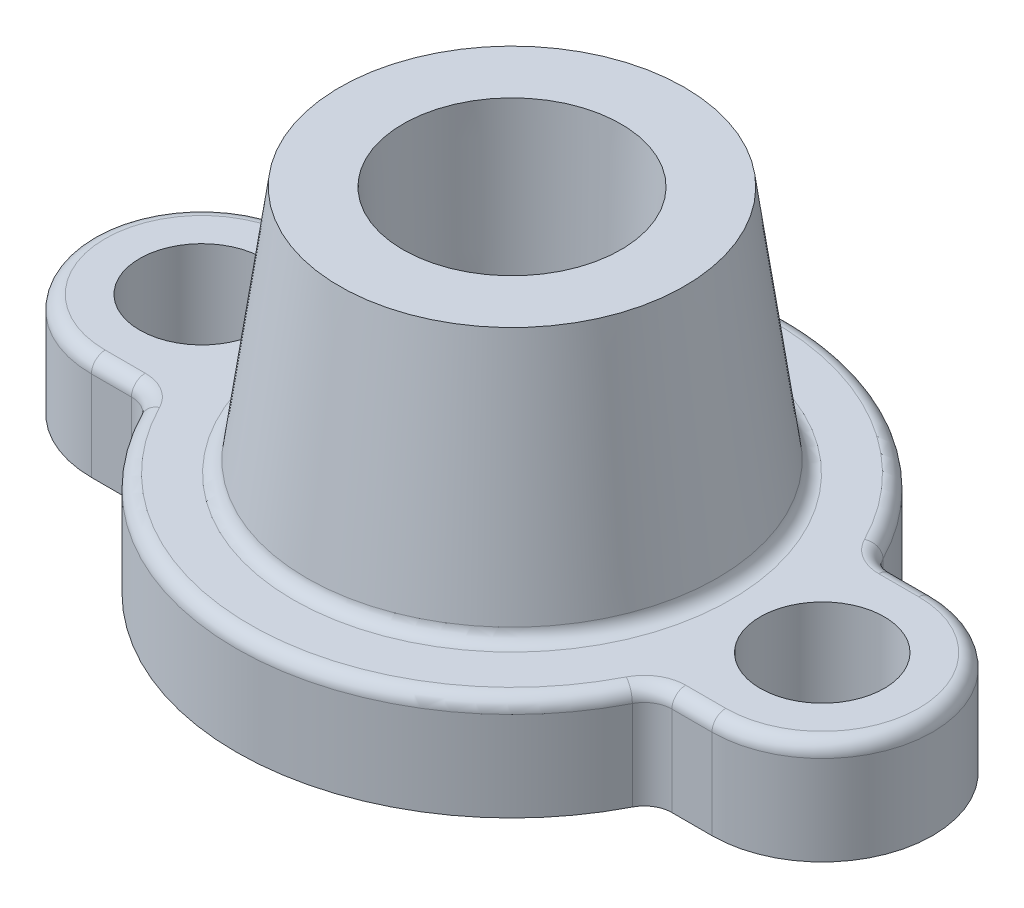
ISO-10303-21;
HEADER;
FILE_DESCRIPTION(('STEP AP214'),'2;1');
FILE_NAME('part.step','',(''),(''),'','','');
FILE_SCHEMA(('AUTOMOTIVE_DESIGN { 1 0 10303 214 1 1 1 1 }'));
ENDSEC;
DATA;
#1=APPLICATION_CONTEXT('core data for automotive mechanical design processes');
#2=APPLICATION_PROTOCOL_DEFINITION('international standard','automotive_design',2000,#1);
#3=PRODUCT_CONTEXT('',#1,'mechanical');
#4=PRODUCT('Part','Part','',(#3));
#5=PRODUCT_RELATED_PRODUCT_CATEGORY('part','',(#4));
#6=PRODUCT_DEFINITION_FORMATION('','',#4);
#7=PRODUCT_DEFINITION_CONTEXT('part definition',#1,'design');
#8=PRODUCT_DEFINITION('design','',#6,#7);
#9=PRODUCT_DEFINITION_SHAPE('','',#8);
#10=(LENGTH_UNIT() NAMED_UNIT(*) SI_UNIT(.MILLI.,.METRE.));
#11=(NAMED_UNIT(*) PLANE_ANGLE_UNIT() SI_UNIT($,.RADIAN.));
#12=(NAMED_UNIT(*) SI_UNIT($,.STERADIAN.) SOLID_ANGLE_UNIT());
#13=UNCERTAINTY_MEASURE_WITH_UNIT(LENGTH_MEASURE(1.E-05),#10,'distance_accuracy_value','');
#14=(GEOMETRIC_REPRESENTATION_CONTEXT(3) GLOBAL_UNCERTAINTY_ASSIGNED_CONTEXT((#13)) GLOBAL_UNIT_ASSIGNED_CONTEXT((#10,
#11,#12)) REPRESENTATION_CONTEXT('',''));
#15=CARTESIAN_POINT('',(0.,0.,0.));
#16=DIRECTION('',(0.,0.,1.));
#17=DIRECTION('',(1.,0.,0.));
#18=AXIS2_PLACEMENT_3D('',#15,#16,#17);
#19=CARTESIAN_POINT('',(0.,7.50000000000001,0.));
#20=DIRECTION('',(0.,1.,0.));
#21=DIRECTION('',(0.,0.,1.));
#22=AXIS2_PLACEMENT_3D('',#19,#20,#21);
#23=PLANE('',#22);
#24=CARTESIAN_POINT('',(0.,7.50000000000001,0.));
#25=DIRECTION('',(0.,1.,0.));
#26=DIRECTION('',(0.,0.,1.));
#27=AXIS2_PLACEMENT_3D('',#24,#25,#26);
#28=CIRCLE('',#27,15.8707101025215);
#29=CARTESIAN_POINT('',(0.,7.50000000000001,15.8707101025215));
#30=VERTEX_POINT('',#29);
#31=EDGE_CURVE('E260',#30,#30,#28,.F.);
#32=ORIENTED_EDGE('',*,*,#31,.T.);
#33=EDGE_LOOP('',(#32));
#34=FACE_BOUND('',#33,.T.);
#35=CARTESIAN_POINT('',(19.5959179422654,7.50000000000001,-10.));
#36=DIRECTION('',(0.,1.,0.));
#37=DIRECTION('',(0.,0.,1.));
#38=AXIS2_PLACEMENT_3D('',#35,#36,#37);
#39=CIRCLE('',#38,3.);
#40=CARTESIAN_POINT('',(19.5959179422654,7.50000000000001,-7.));
#41=VERTEX_POINT('',#40);
#42=CARTESIAN_POINT('',(16.9237473137747,7.50000000000001,-8.63636363636364));
#43=VERTEX_POINT('',#42);
#44=EDGE_CURVE('E256',#41,#43,#39,.F.);
#45=ORIENTED_EDGE('',*,*,#44,.T.);
#46=CARTESIAN_POINT('',(0.,7.50000000000001,0.));
#47=DIRECTION('',(0.,1.,0.));
#48=DIRECTION('',(0.,0.,1.));
#49=AXIS2_PLACEMENT_3D('',#46,#47,#48);
#50=CIRCLE('',#49,19.);
#51=CARTESIAN_POINT('',(-16.9237473137747,7.50000000000001,-8.63636363636364));
#52=VERTEX_POINT('',#51);
#53=EDGE_CURVE('E258',#43,#52,#50,.T.);
#54=ORIENTED_EDGE('',*,*,#53,.T.);
#55=CARTESIAN_POINT('',(-19.5959179422654,7.50000000000001,-10.));
#56=DIRECTION('',(0.,1.,0.));
#57=DIRECTION('',(0.,0.,1.));
#58=AXIS2_PLACEMENT_3D('',#55,#56,#57);
#59=CIRCLE('',#58,3.);
#60=CARTESIAN_POINT('',(-19.5959179422654,7.50000000000001,-7.));
#61=VERTEX_POINT('',#60);
#62=EDGE_CURVE('E250',#52,#61,#59,.F.);
#63=ORIENTED_EDGE('',*,*,#62,.T.);
#64=DIRECTION('',(-1.,0.,0.));
#65=VECTOR('',#64,1.);
#66=CARTESIAN_POINT('',(-22.5,7.50000000000001,-7.00000000000001));
#67=LINE('',#66,#65);
#68=CARTESIAN_POINT('',(-22.5,7.50000000000001,-7.));
#69=VERTEX_POINT('',#68);
#70=EDGE_CURVE('E245',#61,#69,#67,.T.);
#71=ORIENTED_EDGE('',*,*,#70,.T.);
#72=CARTESIAN_POINT('',(-22.5,7.50000000000001,0.));
#73=DIRECTION('',(0.,1.,0.));
#74=DIRECTION('',(0.,0.,1.));
#75=AXIS2_PLACEMENT_3D('',#72,#73,#74);
#76=CIRCLE('',#75,7.);
#77=CARTESIAN_POINT('',(-22.5,7.50000000000001,7.));
#78=VERTEX_POINT('',#77);
#79=EDGE_CURVE('E235',#69,#78,#76,.T.);
#80=ORIENTED_EDGE('',*,*,#79,.T.);
#81=DIRECTION('',(1.,0.,0.));
#82=VECTOR('',#81,1.);
#83=CARTESIAN_POINT('',(-19.5959179422654,7.50000000000001,7.));
#84=LINE('',#83,#82);
#85=CARTESIAN_POINT('',(-19.5959179422654,7.50000000000001,7.));
#86=VERTEX_POINT('',#85);
#87=EDGE_CURVE('E237',#78,#86,#84,.T.);
#88=ORIENTED_EDGE('',*,*,#87,.T.);
#89=CARTESIAN_POINT('',(-19.5959179422654,7.50000000000001,10.));
#90=DIRECTION('',(0.,1.,0.));
#91=DIRECTION('',(0.,0.,1.));
#92=AXIS2_PLACEMENT_3D('',#89,#90,#91);
#93=CIRCLE('',#92,3.);
#94=CARTESIAN_POINT('',(-16.9237473137747,7.50000000000001,8.63636363636364));
#95=VERTEX_POINT('',#94);
#96=EDGE_CURVE('E239',#86,#95,#93,.F.);
#97=ORIENTED_EDGE('',*,*,#96,.T.);
#98=CARTESIAN_POINT('',(0.,7.50000000000001,0.));
#99=DIRECTION('',(0.,1.,0.));
#100=DIRECTION('',(0.,0.,1.));
#101=AXIS2_PLACEMENT_3D('',#98,#99,#100);
#102=CIRCLE('',#101,19.);
#103=CARTESIAN_POINT('',(16.9237473137747,7.50000000000001,8.63636363636364));
#104=VERTEX_POINT('',#103);
#105=EDGE_CURVE('E241',#95,#104,#102,.T.);
#106=ORIENTED_EDGE('',*,*,#105,.T.);
#107=CARTESIAN_POINT('',(19.5959179422654,7.50000000000001,10.));
#108=DIRECTION('',(0.,1.,0.));
#109=DIRECTION('',(0.,0.,1.));
#110=AXIS2_PLACEMENT_3D('',#107,#108,#109);
#111=CIRCLE('',#110,3.);
#112=CARTESIAN_POINT('',(19.5959179422654,7.50000000000001,7.));
#113=VERTEX_POINT('',#112);
#114=EDGE_CURVE('E243',#104,#113,#111,.F.);
#115=ORIENTED_EDGE('',*,*,#114,.T.);
#116=DIRECTION('',(1.,0.,0.));
#117=VECTOR('',#116,1.);
#118=CARTESIAN_POINT('',(22.5,7.50000000000001,7.));
#119=LINE('',#118,#117);
#120=CARTESIAN_POINT('',(22.5,7.50000000000001,7.));
#121=VERTEX_POINT('',#120);
#122=EDGE_CURVE('E248',#113,#121,#119,.T.);
#123=ORIENTED_EDGE('',*,*,#122,.T.);
#124=CARTESIAN_POINT('',(22.5,7.50000000000001,0.));
#125=DIRECTION('',(0.,1.,0.));
#126=DIRECTION('',(0.,0.,1.));
#127=AXIS2_PLACEMENT_3D('',#124,#125,#126);
#128=CIRCLE('',#127,7.);
#129=CARTESIAN_POINT('',(22.5,7.50000000000001,-7.));
#130=VERTEX_POINT('',#129);
#131=EDGE_CURVE('E252',#121,#130,#128,.T.);
#132=ORIENTED_EDGE('',*,*,#131,.T.);
#133=DIRECTION('',(-1.,0.,0.));
#134=VECTOR('',#133,1.);
#135=CARTESIAN_POINT('',(19.5959179422654,7.50000000000001,-7.));
#136=LINE('',#135,#134);
#137=EDGE_CURVE('E254',#130,#41,#136,.T.);
#138=ORIENTED_EDGE('',*,*,#137,.T.);
#139=EDGE_LOOP('',(#45,#54,#63,#71,#80,#88,#97,#106,#115,#123,#132,#138));
#140=FACE_BOUND('',#139,.T.);
#141=CARTESIAN_POINT('',(-22.5,7.50000000000001,0.));
#142=DIRECTION('',(0.,1.,0.));
#143=DIRECTION('',(0.,0.,1.));
#144=AXIS2_PLACEMENT_3D('',#141,#142,#143);
#145=CIRCLE('',#144,4.5);
#146=CARTESIAN_POINT('',(-22.5,7.50000000000001,4.5));
#147=VERTEX_POINT('',#146);
#148=EDGE_CURVE('E356',#147,#147,#145,.T.);
#149=ORIENTED_EDGE('',*,*,#148,.F.);
#150=EDGE_LOOP('',(#149));
#151=FACE_BOUND('',#150,.T.);
#152=CARTESIAN_POINT('',(22.5,7.50000000000001,0.));
#153=DIRECTION('',(0.,1.,0.));
#154=DIRECTION('',(0.,0.,1.));
#155=AXIS2_PLACEMENT_3D('',#152,#153,#154);
#156=CIRCLE('',#155,4.5);
#157=CARTESIAN_POINT('',(22.5,7.50000000000001,4.5));
#158=VERTEX_POINT('',#157);
#159=EDGE_CURVE('E350',#158,#158,#156,.T.);
#160=ORIENTED_EDGE('',*,*,#159,.F.);
#161=EDGE_LOOP('',(#160));
#162=FACE_BOUND('',#161,.T.);
#163=ADVANCED_FACE('F32',(#34,#140,#151,#162),#23,.T.);
#164=CARTESIAN_POINT('',(0.,0.,0.));
#165=DIRECTION('',(0.,1.,0.));
#166=DIRECTION('',(0.,0.,1.));
#167=AXIS2_PLACEMENT_3D('',#164,#165,#166);
#168=PLANE('',#167);
#169=CARTESIAN_POINT('',(0.,0.,0.));
#170=DIRECTION('',(0.,1.,0.));
#171=DIRECTION('',(0.,0.,1.));
#172=AXIS2_PLACEMENT_3D('',#169,#170,#171);
#173=CIRCLE('',#172,7.50000000000001);
#174=CARTESIAN_POINT('',(0.,0.,7.50000000000001));
#175=VERTEX_POINT('',#174);
#176=EDGE_CURVE('E11',#175,#175,#173,.T.);
#177=ORIENTED_EDGE('',*,*,#176,.T.);
#178=EDGE_LOOP('',(#177));
#179=FACE_BOUND('',#178,.T.);
#180=CARTESIAN_POINT('',(-22.5,0.,0.));
#181=DIRECTION('',(0.,1.,0.));
#182=DIRECTION('',(0.,0.,1.));
#183=AXIS2_PLACEMENT_3D('',#180,#181,#182);
#184=CIRCLE('',#183,4.5);
#185=CARTESIAN_POINT('',(-22.5,0.,4.5));
#186=VERTEX_POINT('',#185);
#187=EDGE_CURVE('E353',#186,#186,#184,.T.);
#188=ORIENTED_EDGE('',*,*,#187,.T.);
#189=EDGE_LOOP('',(#188));
#190=FACE_BOUND('',#189,.T.);
#191=CARTESIAN_POINT('',(0.,0.,0.));
#192=DIRECTION('',(0.,1.,0.));
#193=DIRECTION('',(0.,0.,1.));
#194=AXIS2_PLACEMENT_3D('',#191,#192,#193);
#195=CIRCLE('',#194,20.);
#196=CARTESIAN_POINT('',(17.8144708566049,0.,-9.09090909090909));
#197=VERTEX_POINT('',#196);
#198=CARTESIAN_POINT('',(-17.8144708566049,0.,-9.0909090909091));
#199=VERTEX_POINT('',#198);
#200=EDGE_CURVE('E182',#197,#199,#195,.T.);
#201=ORIENTED_EDGE('',*,*,#200,.F.);
#202=CARTESIAN_POINT('',(19.5959179422654,0.,-10.));
#203=DIRECTION('',(0.,1.,0.));
#204=DIRECTION('',(0.,0.,1.));
#205=AXIS2_PLACEMENT_3D('',#202,#203,#204);
#206=CIRCLE('',#205,2.);
#207=CARTESIAN_POINT('',(19.5959179422654,0.,-8.));
#208=VERTEX_POINT('',#207);
#209=EDGE_CURVE('E229',#197,#208,#206,.T.);
#210=ORIENTED_EDGE('',*,*,#209,.T.);
#211=DIRECTION('',(-1.,0.,0.));
#212=VECTOR('',#211,1.);
#213=CARTESIAN_POINT('',(22.5,0.,-8.00000000000001));
#214=LINE('',#213,#212);
#215=CARTESIAN_POINT('',(22.5,0.,-8.00000000000001));
#216=VERTEX_POINT('',#215);
#217=EDGE_CURVE('E202',#216,#208,#214,.T.);
#218=ORIENTED_EDGE('',*,*,#217,.F.);
#219=CARTESIAN_POINT('',(22.5,0.,0.));
#220=DIRECTION('',(0.,1.,0.));
#221=DIRECTION('',(0.,0.,1.));
#222=AXIS2_PLACEMENT_3D('',#219,#220,#221);
#223=CIRCLE('',#222,8.);
#224=CARTESIAN_POINT('',(22.5,0.,8.));
#225=VERTEX_POINT('',#224);
#226=EDGE_CURVE('E199',#225,#216,#223,.T.);
#227=ORIENTED_EDGE('',*,*,#226,.F.);
#228=DIRECTION('',(1.,0.,0.));
#229=VECTOR('',#228,1.);
#230=CARTESIAN_POINT('',(18.3303027798234,0.,8.));
#231=LINE('',#230,#229);
#232=CARTESIAN_POINT('',(19.5959179422654,0.,8.));
#233=VERTEX_POINT('',#232);
#234=EDGE_CURVE('E196',#233,#225,#231,.T.);
#235=ORIENTED_EDGE('',*,*,#234,.F.);
#236=CARTESIAN_POINT('',(19.5959179422654,0.,10.));
#237=DIRECTION('',(0.,1.,0.));
#238=DIRECTION('',(0.,0.,1.));
#239=AXIS2_PLACEMENT_3D('',#236,#237,#238);
#240=CIRCLE('',#239,2.);
#241=CARTESIAN_POINT('',(17.8144708566049,0.,9.09090909090909));
#242=VERTEX_POINT('',#241);
#243=EDGE_CURVE('E227',#233,#242,#240,.T.);
#244=ORIENTED_EDGE('',*,*,#243,.T.);
#245=CARTESIAN_POINT('',(0.,0.,0.));
#246=DIRECTION('',(0.,1.,0.));
#247=DIRECTION('',(0.,0.,1.));
#248=AXIS2_PLACEMENT_3D('',#245,#246,#247);
#249=CIRCLE('',#248,20.);
#250=CARTESIAN_POINT('',(-17.8144708566049,0.,9.09090909090909));
#251=VERTEX_POINT('',#250);
#252=EDGE_CURVE('E190',#251,#242,#249,.T.);
#253=ORIENTED_EDGE('',*,*,#252,.F.);
#254=CARTESIAN_POINT('',(-19.5959179422654,0.,10.));
#255=DIRECTION('',(0.,1.,0.));
#256=DIRECTION('',(0.,0.,1.));
#257=AXIS2_PLACEMENT_3D('',#254,#255,#256);
#258=CIRCLE('',#257,2.);
#259=CARTESIAN_POINT('',(-19.5959179422654,0.,8.));
#260=VERTEX_POINT('',#259);
#261=EDGE_CURVE('E233',#251,#260,#258,.T.);
#262=ORIENTED_EDGE('',*,*,#261,.T.);
#263=DIRECTION('',(1.,0.,0.));
#264=VECTOR('',#263,1.);
#265=CARTESIAN_POINT('',(-22.5,0.,8.));
#266=LINE('',#265,#264);
#267=CARTESIAN_POINT('',(-22.5,0.,8.));
#268=VERTEX_POINT('',#267);
#269=EDGE_CURVE('E188',#268,#260,#266,.T.);
#270=ORIENTED_EDGE('',*,*,#269,.F.);
#271=CARTESIAN_POINT('',(-22.5,0.,0.));
#272=DIRECTION('',(0.,1.,0.));
#273=DIRECTION('',(0.,0.,1.));
#274=AXIS2_PLACEMENT_3D('',#271,#272,#273);
#275=CIRCLE('',#274,8.);
#276=CARTESIAN_POINT('',(-22.5,0.,-8.));
#277=VERTEX_POINT('',#276);
#278=EDGE_CURVE('E165',#277,#268,#275,.T.);
#279=ORIENTED_EDGE('',*,*,#278,.F.);
#280=DIRECTION('',(-1.,0.,0.));
#281=VECTOR('',#280,1.);
#282=CARTESIAN_POINT('',(-18.3303027798234,0.,-8.));
#283=LINE('',#282,#281);
#284=CARTESIAN_POINT('',(-19.5959179422654,0.,-8.00000000000001));
#285=VERTEX_POINT('',#284);
#286=EDGE_CURVE('E176',#285,#277,#283,.T.);
#287=ORIENTED_EDGE('',*,*,#286,.F.);
#288=CARTESIAN_POINT('',(-19.5959179422654,0.,-10.));
#289=DIRECTION('',(0.,1.,0.));
#290=DIRECTION('',(0.,0.,1.));
#291=AXIS2_PLACEMENT_3D('',#288,#289,#290);
#292=CIRCLE('',#291,2.);
#293=EDGE_CURVE('E231',#285,#199,#292,.T.);
#294=ORIENTED_EDGE('',*,*,#293,.T.);
#295=EDGE_LOOP('',(#201,#210,#218,#227,#235,#244,#253,#262,#270,#279,#287,#294));
#296=FACE_BOUND('',#295,.T.);
#297=CARTESIAN_POINT('',(22.5,0.,0.));
#298=DIRECTION('',(0.,1.,0.));
#299=DIRECTION('',(0.,0.,1.));
#300=AXIS2_PLACEMENT_3D('',#297,#298,#299);
#301=CIRCLE('',#300,4.5);
#302=CARTESIAN_POINT('',(22.5,0.,4.5));
#303=VERTEX_POINT('',#302);
#304=EDGE_CURVE('E349',#303,#303,#301,.T.);
#305=ORIENTED_EDGE('',*,*,#304,.T.);
#306=EDGE_LOOP('',(#305));
#307=FACE_BOUND('',#306,.T.);
#308=ADVANCED_FACE('F185',(#179,#190,#296,#307),#168,.F.);
#309=CARTESIAN_POINT('',(0.,7.50000000000001,0.));
#310=DIRECTION('',(0.,-1.,0.));
#311=DIRECTION('',(0.,0.,-1.));
#312=AXIS2_PLACEMENT_3D('',#309,#310,#311);
#313=CYLINDRICAL_SURFACE('',#312,20.);
#314=DIRECTION('',(0.,-1.,0.));
#315=VECTOR('',#314,1.);
#316=CARTESIAN_POINT('',(-17.8144708566049,7.50000000000001,-9.0909090909091));
#317=LINE('',#316,#315);
#318=CARTESIAN_POINT('',(-17.8144708566049,6.50000000000001,-9.0909090909091));
#319=VERTEX_POINT('',#318);
#320=EDGE_CURVE('E216',#199,#319,#317,.F.);
#321=ORIENTED_EDGE('',*,*,#320,.T.);
#322=CARTESIAN_POINT('',(0.,6.50000000000001,0.));
#323=DIRECTION('',(0.,1.,0.));
#324=DIRECTION('',(0.,0.,1.));
#325=AXIS2_PLACEMENT_3D('',#322,#323,#324);
#326=CIRCLE('',#325,20.);
#327=CARTESIAN_POINT('',(17.8144708566049,6.50000000000001,-9.09090909090909));
#328=VERTEX_POINT('',#327);
#329=EDGE_CURVE('E267',#319,#328,#326,.F.);
#330=ORIENTED_EDGE('',*,*,#329,.T.);
#331=DIRECTION('',(0.,-1.,0.));
#332=VECTOR('',#331,1.);
#333=CARTESIAN_POINT('',(17.8144708566049,7.50000000000001,-9.09090909090909));
#334=LINE('',#333,#332);
#335=EDGE_CURVE('E219',#328,#197,#334,.T.);
#336=ORIENTED_EDGE('',*,*,#335,.T.);
#337=ORIENTED_EDGE('',*,*,#200,.T.);
#338=EDGE_LOOP('',(#321,#330,#336,#337));
#339=FACE_BOUND('',#338,.T.);
#340=ADVANCED_FACE('F363',(#339),#313,.T.);
#341=CARTESIAN_POINT('',(-18.3303027798234,7.50000000000001,-8.));
#342=DIRECTION('',(0.,0.,1.));
#343=DIRECTION('',(1.,0.,0.));
#344=AXIS2_PLACEMENT_3D('',#341,#342,#343);
#345=PLANE('',#344);
#346=DIRECTION('',(0.,-1.,0.));
#347=VECTOR('',#346,1.);
#348=CARTESIAN_POINT('',(-22.5,7.50000000000001,-8.));
#349=LINE('',#348,#347);
#350=CARTESIAN_POINT('',(-22.5,6.50000000000001,-8.));
#351=VERTEX_POINT('',#350);
#352=EDGE_CURVE('E160',#351,#277,#349,.T.);
#353=ORIENTED_EDGE('',*,*,#352,.F.);
#354=DIRECTION('',(-1.,0.,0.));
#355=VECTOR('',#354,1.);
#356=CARTESIAN_POINT('',(-19.5959179422654,6.50000000000001,-8.00000000000001));
#357=LINE('',#356,#355);
#358=CARTESIAN_POINT('',(-19.5959179422654,6.50000000000001,-8.00000000000001));
#359=VERTEX_POINT('',#358);
#360=EDGE_CURVE('E263',#351,#359,#357,.F.);
#361=ORIENTED_EDGE('',*,*,#360,.T.);
#362=DIRECTION('',(0.,1.,0.));
#363=VECTOR('',#362,1.);
#364=CARTESIAN_POINT('',(-19.5959179422654,0.,-8.00000000000001));
#365=LINE('',#364,#363);
#366=EDGE_CURVE('E179',#359,#285,#365,.F.);
#367=ORIENTED_EDGE('',*,*,#366,.T.);
#368=ORIENTED_EDGE('',*,*,#286,.T.);
#369=EDGE_LOOP('',(#353,#361,#367,#368));
#370=FACE_BOUND('',#369,.T.);
#371=ADVANCED_FACE('F177',(#370),#345,.F.);
#372=CARTESIAN_POINT('',(-22.5,7.50000000000001,0.));
#373=DIRECTION('',(0.,-1.,0.));
#374=DIRECTION('',(0.,0.,-1.));
#375=AXIS2_PLACEMENT_3D('',#372,#373,#374);
#376=CYLINDRICAL_SURFACE('',#375,8.);
#377=DIRECTION('',(0.,-1.,0.));
#378=VECTOR('',#377,1.);
#379=CARTESIAN_POINT('',(-22.5,7.50000000000001,8.));
#380=LINE('',#379,#378);
#381=CARTESIAN_POINT('',(-22.5,6.50000000000001,8.));
#382=VERTEX_POINT('',#381);
#383=EDGE_CURVE('E173',#382,#268,#380,.T.);
#384=ORIENTED_EDGE('',*,*,#383,.F.);
#385=CARTESIAN_POINT('',(-22.5,6.50000000000001,0.));
#386=DIRECTION('',(0.,1.,0.));
#387=DIRECTION('',(0.,0.,1.));
#388=AXIS2_PLACEMENT_3D('',#385,#386,#387);
#389=CIRCLE('',#388,8.);
#390=EDGE_CURVE('E168',#382,#351,#389,.F.);
#391=ORIENTED_EDGE('',*,*,#390,.T.);
#392=ORIENTED_EDGE('',*,*,#352,.T.);
#393=ORIENTED_EDGE('',*,*,#278,.T.);
#394=EDGE_LOOP('',(#384,#391,#392,#393));
#395=FACE_BOUND('',#394,.T.);
#396=ADVANCED_FACE('F163',(#395),#376,.T.);
#397=CARTESIAN_POINT('',(-22.5,7.50000000000001,8.));
#398=DIRECTION('',(0.,0.,-1.));
#399=DIRECTION('',(-1.,0.,0.));
#400=AXIS2_PLACEMENT_3D('',#397,#398,#399);
#401=PLANE('',#400);
#402=DIRECTION('',(0.,1.,0.));
#403=VECTOR('',#402,1.);
#404=CARTESIAN_POINT('',(-19.5959179422654,7.50000000000001,8.));
#405=LINE('',#404,#403);
#406=CARTESIAN_POINT('',(-19.5959179422654,6.50000000000001,8.));
#407=VERTEX_POINT('',#406);
#408=EDGE_CURVE('E224',#260,#407,#405,.T.);
#409=ORIENTED_EDGE('',*,*,#408,.T.);
#410=DIRECTION('',(1.,0.,0.));
#411=VECTOR('',#410,1.);
#412=CARTESIAN_POINT('',(-22.5,6.50000000000001,8.));
#413=LINE('',#412,#411);
#414=EDGE_CURVE('E277',#407,#382,#413,.F.);
#415=ORIENTED_EDGE('',*,*,#414,.T.);
#416=ORIENTED_EDGE('',*,*,#383,.T.);
#417=ORIENTED_EDGE('',*,*,#269,.T.);
#418=EDGE_LOOP('',(#409,#415,#416,#417));
#419=FACE_BOUND('',#418,.T.);
#420=ADVANCED_FACE('F671',(#419),#401,.F.);
#421=CARTESIAN_POINT('',(0.,7.50000000000001,0.));
#422=DIRECTION('',(0.,-1.,0.));
#423=DIRECTION('',(0.,0.,-1.));
#424=AXIS2_PLACEMENT_3D('',#421,#422,#423);
#425=CYLINDRICAL_SURFACE('',#424,20.);
#426=DIRECTION('',(0.,-1.,0.));
#427=VECTOR('',#426,1.);
#428=CARTESIAN_POINT('',(17.8144708566049,7.50000000000001,9.09090909090909));
#429=LINE('',#428,#427);
#430=CARTESIAN_POINT('',(17.8144708566049,6.50000000000001,9.09090909090909));
#431=VERTEX_POINT('',#430);
#432=EDGE_CURVE('E213',#242,#431,#429,.F.);
#433=ORIENTED_EDGE('',*,*,#432,.T.);
#434=CARTESIAN_POINT('',(0.,6.50000000000001,0.));
#435=DIRECTION('',(0.,1.,0.));
#436=DIRECTION('',(0.,0.,1.));
#437=AXIS2_PLACEMENT_3D('',#434,#435,#436);
#438=CIRCLE('',#437,20.);
#439=CARTESIAN_POINT('',(-17.8144708566049,6.50000000000001,9.09090909090909));
#440=VERTEX_POINT('',#439);
#441=EDGE_CURVE('E273',#431,#440,#438,.F.);
#442=ORIENTED_EDGE('',*,*,#441,.T.);
#443=DIRECTION('',(0.,-1.,0.));
#444=VECTOR('',#443,1.);
#445=CARTESIAN_POINT('',(-17.8144708566049,7.50000000000001,9.09090909090909));
#446=LINE('',#445,#444);
#447=EDGE_CURVE('E211',#440,#251,#446,.T.);
#448=ORIENTED_EDGE('',*,*,#447,.T.);
#449=ORIENTED_EDGE('',*,*,#252,.T.);
#450=EDGE_LOOP('',(#433,#442,#448,#449));
#451=FACE_BOUND('',#450,.T.);
#452=ADVANCED_FACE('F662',(#451),#425,.T.);
#453=CARTESIAN_POINT('',(18.3303027798234,7.50000000000001,8.));
#454=DIRECTION('',(0.,0.,-1.));
#455=DIRECTION('',(-1.,0.,0.));
#456=AXIS2_PLACEMENT_3D('',#453,#454,#455);
#457=PLANE('',#456);
#458=DIRECTION('',(0.,-1.,0.));
#459=VECTOR('',#458,1.);
#460=CARTESIAN_POINT('',(22.5,7.50000000000001,8.));
#461=LINE('',#460,#459);
#462=CARTESIAN_POINT('',(22.5,6.50000000000001,8.));
#463=VERTEX_POINT('',#462);
#464=EDGE_CURVE('E207',#463,#225,#461,.T.);
#465=ORIENTED_EDGE('',*,*,#464,.F.);
#466=DIRECTION('',(1.,0.,0.));
#467=VECTOR('',#466,1.);
#468=CARTESIAN_POINT('',(19.5959179422654,6.50000000000001,8.));
#469=LINE('',#468,#467);
#470=CARTESIAN_POINT('',(19.5959179422654,6.50000000000001,8.));
#471=VERTEX_POINT('',#470);
#472=EDGE_CURVE('E280',#463,#471,#469,.F.);
#473=ORIENTED_EDGE('',*,*,#472,.T.);
#474=DIRECTION('',(0.,1.,0.));
#475=VECTOR('',#474,1.);
#476=CARTESIAN_POINT('',(19.5959179422654,0.,8.));
#477=LINE('',#476,#475);
#478=EDGE_CURVE('E172',#471,#233,#477,.F.);
#479=ORIENTED_EDGE('',*,*,#478,.T.);
#480=ORIENTED_EDGE('',*,*,#234,.T.);
#481=EDGE_LOOP('',(#465,#473,#479,#480));
#482=FACE_BOUND('',#481,.T.);
#483=ADVANCED_FACE('F414',(#482),#457,.F.);
#484=CARTESIAN_POINT('',(22.5,7.50000000000001,0.));
#485=DIRECTION('',(0.,-1.,0.));
#486=DIRECTION('',(0.,0.,-1.));
#487=AXIS2_PLACEMENT_3D('',#484,#485,#486);
#488=CYLINDRICAL_SURFACE('',#487,8.);
#489=DIRECTION('',(0.,-1.,0.));
#490=VECTOR('',#489,1.);
#491=CARTESIAN_POINT('',(22.5,7.50000000000001,-8.00000000000001));
#492=LINE('',#491,#490);
#493=CARTESIAN_POINT('',(22.5,6.50000000000001,-8.00000000000001));
#494=VERTEX_POINT('',#493);
#495=EDGE_CURVE('E205',#494,#216,#492,.T.);
#496=ORIENTED_EDGE('',*,*,#495,.F.);
#497=CARTESIAN_POINT('',(22.5,6.50000000000001,0.));
#498=DIRECTION('',(0.,1.,0.));
#499=DIRECTION('',(0.,0.,1.));
#500=AXIS2_PLACEMENT_3D('',#497,#498,#499);
#501=CIRCLE('',#500,8.);
#502=EDGE_CURVE('E49',#494,#463,#501,.F.);
#503=ORIENTED_EDGE('',*,*,#502,.T.);
#504=ORIENTED_EDGE('',*,*,#464,.T.);
#505=ORIENTED_EDGE('',*,*,#226,.T.);
#506=EDGE_LOOP('',(#496,#503,#504,#505));
#507=FACE_BOUND('',#506,.T.);
#508=ADVANCED_FACE('F423',(#507),#488,.T.);
#509=CARTESIAN_POINT('',(22.5,7.50000000000001,-8.00000000000001));
#510=DIRECTION('',(0.,0.,1.));
#511=DIRECTION('',(1.,0.,0.));
#512=AXIS2_PLACEMENT_3D('',#509,#510,#511);
#513=PLANE('',#512);
#514=DIRECTION('',(0.,1.,0.));
#515=VECTOR('',#514,1.);
#516=CARTESIAN_POINT('',(19.5959179422654,7.50000000000001,-8.));
#517=LINE('',#516,#515);
#518=CARTESIAN_POINT('',(19.5959179422654,6.50000000000001,-8.));
#519=VERTEX_POINT('',#518);
#520=EDGE_CURVE('E221',#208,#519,#517,.T.);
#521=ORIENTED_EDGE('',*,*,#520,.T.);
#522=DIRECTION('',(-1.,0.,0.));
#523=VECTOR('',#522,1.);
#524=CARTESIAN_POINT('',(22.5,6.50000000000001,-8.00000000000001));
#525=LINE('',#524,#523);
#526=EDGE_CURVE('E57',#519,#494,#525,.F.);
#527=ORIENTED_EDGE('',*,*,#526,.T.);
#528=ORIENTED_EDGE('',*,*,#495,.T.);
#529=ORIENTED_EDGE('',*,*,#217,.T.);
#530=EDGE_LOOP('',(#521,#527,#528,#529));
#531=FACE_BOUND('',#530,.T.);
#532=ADVANCED_FACE('F424',(#531),#513,.F.);
#533=CARTESIAN_POINT('',(-22.5,7.50000000000001,0.));
#534=DIRECTION('',(0.,-1.,0.));
#535=DIRECTION('',(0.,0.,-1.));
#536=AXIS2_PLACEMENT_3D('',#533,#534,#535);
#537=CYLINDRICAL_SURFACE('',#536,4.5);
#538=ORIENTED_EDGE('',*,*,#148,.T.);
#539=EDGE_LOOP('',(#538));
#540=FACE_BOUND('',#539,.T.);
#541=ORIENTED_EDGE('',*,*,#187,.F.);
#542=EDGE_LOOP('',(#541));
#543=FACE_BOUND('',#542,.T.);
#544=ADVANCED_FACE('F426',(#540,#543),#537,.F.);
#545=CARTESIAN_POINT('',(22.5,7.50000000000001,0.));
#546=DIRECTION('',(0.,-1.,0.));
#547=DIRECTION('',(0.,0.,-1.));
#548=AXIS2_PLACEMENT_3D('',#545,#546,#547);
#549=CYLINDRICAL_SURFACE('',#548,4.5);
#550=ORIENTED_EDGE('',*,*,#159,.T.);
#551=EDGE_LOOP('',(#550));
#552=FACE_BOUND('',#551,.T.);
#553=ORIENTED_EDGE('',*,*,#304,.F.);
#554=EDGE_LOOP('',(#553));
#555=FACE_BOUND('',#554,.T.);
#556=ADVANCED_FACE('F432',(#552,#555),#549,.F.);
#557=CARTESIAN_POINT('',(19.5959179422654,7.50000000000001,10.));
#558=DIRECTION('',(0.,-1.,0.));
#559=DIRECTION('',(0.,0.,-1.));
#560=AXIS2_PLACEMENT_3D('',#557,#558,#559);
#561=CYLINDRICAL_SURFACE('',#560,2.);
#562=ORIENTED_EDGE('',*,*,#478,.F.);
#563=CARTESIAN_POINT('',(19.5959179422654,6.50000000000001,10.));
#564=DIRECTION('',(0.,1.,0.));
#565=DIRECTION('',(0.,0.,1.));
#566=AXIS2_PLACEMENT_3D('',#563,#564,#565);
#567=CIRCLE('',#566,2.);
#568=EDGE_CURVE('E271',#471,#431,#567,.T.);
#569=ORIENTED_EDGE('',*,*,#568,.T.);
#570=ORIENTED_EDGE('',*,*,#432,.F.);
#571=ORIENTED_EDGE('',*,*,#243,.F.);
#572=EDGE_LOOP('',(#562,#569,#570,#571));
#573=FACE_BOUND('',#572,.T.);
#574=ADVANCED_FACE('F417',(#573),#561,.F.);
#575=CARTESIAN_POINT('',(19.5959179422654,7.50000000000001,-10.));
#576=DIRECTION('',(0.,-1.,0.));
#577=DIRECTION('',(0.,0.,-1.));
#578=AXIS2_PLACEMENT_3D('',#575,#576,#577);
#579=CYLINDRICAL_SURFACE('',#578,2.);
#580=ORIENTED_EDGE('',*,*,#335,.F.);
#581=CARTESIAN_POINT('',(19.5959179422654,6.50000000000001,-10.));
#582=DIRECTION('',(0.,1.,0.));
#583=DIRECTION('',(0.,0.,1.));
#584=AXIS2_PLACEMENT_3D('',#581,#582,#583);
#585=CIRCLE('',#584,2.);
#586=EDGE_CURVE('E269',#328,#519,#585,.T.);
#587=ORIENTED_EDGE('',*,*,#586,.T.);
#588=ORIENTED_EDGE('',*,*,#520,.F.);
#589=ORIENTED_EDGE('',*,*,#209,.F.);
#590=EDGE_LOOP('',(#580,#587,#588,#589));
#591=FACE_BOUND('',#590,.T.);
#592=ADVANCED_FACE('F393',(#591),#579,.F.);
#593=CARTESIAN_POINT('',(-19.5959179422654,7.50000000000001,-10.));
#594=DIRECTION('',(0.,-1.,0.));
#595=DIRECTION('',(0.,0.,-1.));
#596=AXIS2_PLACEMENT_3D('',#593,#594,#595);
#597=CYLINDRICAL_SURFACE('',#596,2.);
#598=ORIENTED_EDGE('',*,*,#366,.F.);
#599=CARTESIAN_POINT('',(-19.5959179422654,6.50000000000001,-10.));
#600=DIRECTION('',(0.,1.,0.));
#601=DIRECTION('',(0.,0.,1.));
#602=AXIS2_PLACEMENT_3D('',#599,#600,#601);
#603=CIRCLE('',#602,2.);
#604=EDGE_CURVE('E265',#359,#319,#603,.T.);
#605=ORIENTED_EDGE('',*,*,#604,.T.);
#606=ORIENTED_EDGE('',*,*,#320,.F.);
#607=ORIENTED_EDGE('',*,*,#293,.F.);
#608=EDGE_LOOP('',(#598,#605,#606,#607));
#609=FACE_BOUND('',#608,.T.);
#610=ADVANCED_FACE('F368',(#609),#597,.F.);
#611=CARTESIAN_POINT('',(-19.5959179422654,7.50000000000001,10.));
#612=DIRECTION('',(0.,-1.,0.));
#613=DIRECTION('',(0.,0.,-1.));
#614=AXIS2_PLACEMENT_3D('',#611,#612,#613);
#615=CYLINDRICAL_SURFACE('',#614,2.);
#616=ORIENTED_EDGE('',*,*,#447,.F.);
#617=CARTESIAN_POINT('',(-19.5959179422654,6.50000000000001,10.));
#618=DIRECTION('',(0.,1.,0.));
#619=DIRECTION('',(0.,0.,1.));
#620=AXIS2_PLACEMENT_3D('',#617,#618,#619);
#621=CIRCLE('',#620,2.);
#622=EDGE_CURVE('E275',#440,#407,#621,.T.);
#623=ORIENTED_EDGE('',*,*,#622,.T.);
#624=ORIENTED_EDGE('',*,*,#408,.F.);
#625=ORIENTED_EDGE('',*,*,#261,.F.);
#626=EDGE_LOOP('',(#616,#623,#624,#625));
#627=FACE_BOUND('',#626,.T.);
#628=ADVANCED_FACE('F452',(#627),#615,.F.);
#629=CARTESIAN_POINT('',(0.,25.5,0.));
#630=DIRECTION('',(0.,1.,0.));
#631=DIRECTION('',(0.,0.,1.));
#632=AXIS2_PLACEMENT_3D('',#629,#630,#631);
#633=PLANE('',#632);
#634=CARTESIAN_POINT('',(0.,25.5,0.));
#635=DIRECTION('',(0.,1.,0.));
#636=DIRECTION('',(0.,0.,1.));
#637=AXIS2_PLACEMENT_3D('',#634,#635,#636);
#638=CIRCLE('',#637,7.903);
#639=CARTESIAN_POINT('',(0.,25.5,7.903));
#640=VERTEX_POINT('',#639);
#641=EDGE_CURVE('E497',#640,#640,#638,.T.);
#642=ORIENTED_EDGE('',*,*,#641,.F.);
#643=EDGE_LOOP('',(#642));
#644=FACE_BOUND('',#643,.T.);
#645=CARTESIAN_POINT('',(0.,25.5,0.));
#646=DIRECTION('',(0.,-1.,0.));
#647=DIRECTION('',(0.,0.,-1.));
#648=AXIS2_PLACEMENT_3D('',#645,#646,#647);
#649=CIRCLE('',#648,12.5);
#650=CARTESIAN_POINT('',(0.,25.5,-12.5));
#651=VERTEX_POINT('',#650);
#652=EDGE_CURVE('E322',#651,#651,#649,.T.);
#653=ORIENTED_EDGE('',*,*,#652,.F.);
#654=EDGE_LOOP('',(#653));
#655=FACE_BOUND('',#654,.T.);
#656=ADVANCED_FACE('F448',(#644,#655),#633,.T.);
#657=CARTESIAN_POINT('',(0.,7.50000000000001,0.));
#658=DIRECTION('',(0.,-1.,0.));
#659=DIRECTION('',(0.,0.,-1.));
#660=AXIS2_PLACEMENT_3D('',#657,#658,#659);
#661=CONICAL_SURFACE('',#660,15.,0.138006023657519);
#662=CARTESIAN_POINT('',(0.,8.36243162872531,0.));
#663=DIRECTION('',(0.,-1.,0.));
#664=DIRECTION('',(0.,0.,-1.));
#665=AXIS2_PLACEMENT_3D('',#662,#663,#664);
#666=CIRCLE('',#665,14.8802178293437);
#667=CARTESIAN_POINT('',(0.,8.36243162872531,-14.8802178293437));
#668=VERTEX_POINT('',#667);
#669=EDGE_CURVE('E283',#668,#668,#666,.F.);
#670=ORIENTED_EDGE('',*,*,#669,.T.);
#671=EDGE_LOOP('',(#670));
#672=FACE_BOUND('',#671,.T.);
#673=ORIENTED_EDGE('',*,*,#652,.T.);
#674=EDGE_LOOP('',(#673));
#675=FACE_BOUND('',#674,.T.);
#676=ADVANCED_FACE('F451',(#672,#675),#661,.T.);
#677=CARTESIAN_POINT('',(0.,6.50000000000001,7.00000000000002));
#678=DIRECTION('',(-1.,0.,0.));
#679=DIRECTION('',(0.,0.,1.));
#680=AXIS2_PLACEMENT_3D('',#677,#678,#679);
#681=CYLINDRICAL_SURFACE('',#680,1.);
#682=CARTESIAN_POINT('',(19.5959179422654,6.50000000000001,7.));
#683=DIRECTION('',(-1.,0.,0.));
#684=DIRECTION('',(0.,0.,1.));
#685=AXIS2_PLACEMENT_3D('',#682,#683,#684);
#686=CIRCLE('',#685,1.);
#687=EDGE_CURVE('E316',#471,#113,#686,.T.);
#688=ORIENTED_EDGE('',*,*,#687,.F.);
#689=ORIENTED_EDGE('',*,*,#472,.F.);
#690=CARTESIAN_POINT('',(22.5,6.50000000000001,7.));
#691=DIRECTION('',(1.,0.,0.));
#692=DIRECTION('',(0.,0.,-1.));
#693=AXIS2_PLACEMENT_3D('',#690,#691,#692);
#694=CIRCLE('',#693,1.);
#695=EDGE_CURVE('E319',#121,#463,#694,.T.);
#696=ORIENTED_EDGE('',*,*,#695,.F.);
#697=ORIENTED_EDGE('',*,*,#122,.F.);
#698=EDGE_LOOP('',(#688,#689,#696,#697));
#699=FACE_BOUND('',#698,.T.);
#700=ADVANCED_FACE('F410',(#699),#681,.T.);
#701=CARTESIAN_POINT('',(22.5,6.50000000000001,0.));
#702=DIRECTION('',(0.,1.,0.));
#703=DIRECTION('',(0.,0.,1.));
#704=AXIS2_PLACEMENT_3D('',#701,#702,#703);
#705=TOROIDAL_SURFACE('',#704,7.,1.);
#706=ORIENTED_EDGE('',*,*,#695,.T.);
#707=ORIENTED_EDGE('',*,*,#502,.F.);
#708=CARTESIAN_POINT('',(22.5,6.50000000000001,-7.));
#709=DIRECTION('',(-1.,0.,0.));
#710=DIRECTION('',(0.,0.,1.));
#711=AXIS2_PLACEMENT_3D('',#708,#709,#710);
#712=CIRCLE('',#711,1.);
#713=EDGE_CURVE('E313',#130,#494,#712,.T.);
#714=ORIENTED_EDGE('',*,*,#713,.F.);
#715=ORIENTED_EDGE('',*,*,#131,.F.);
#716=EDGE_LOOP('',(#706,#707,#714,#715));
#717=FACE_BOUND('',#716,.T.);
#718=ADVANCED_FACE('F404',(#717),#705,.T.);
#719=CARTESIAN_POINT('',(19.5959179422654,6.50000000000001,10.));
#720=DIRECTION('',(0.,1.,0.));
#721=DIRECTION('',(0.,0.,1.));
#722=AXIS2_PLACEMENT_3D('',#719,#720,#721);
#723=TOROIDAL_SURFACE('',#722,3.,1.);
#724=ORIENTED_EDGE('',*,*,#687,.T.);
#725=ORIENTED_EDGE('',*,*,#114,.F.);
#726=CARTESIAN_POINT('',(16.9237473137747,6.50000000000001,8.63636363636364));
#727=DIRECTION('',(-0.454545454545454,0.,0.890723542830246));
#728=DIRECTION('',(0.890723542830247,0.,0.454545454545455));
#729=AXIS2_PLACEMENT_3D('',#726,#727,#728);
#730=CIRCLE('',#729,1.);
#731=EDGE_CURVE('E310',#431,#104,#730,.T.);
#732=ORIENTED_EDGE('',*,*,#731,.F.);
#733=ORIENTED_EDGE('',*,*,#568,.F.);
#734=EDGE_LOOP('',(#724,#725,#732,#733));
#735=FACE_BOUND('',#734,.T.);
#736=ADVANCED_FACE('F582',(#735),#723,.T.);
#737=CARTESIAN_POINT('',(0.,6.50000000000001,-6.99999999999994));
#738=DIRECTION('',(1.,0.,0.));
#739=DIRECTION('',(0.,0.,-1.));
#740=AXIS2_PLACEMENT_3D('',#737,#738,#739);
#741=CYLINDRICAL_SURFACE('',#740,1.);
#742=ORIENTED_EDGE('',*,*,#713,.T.);
#743=ORIENTED_EDGE('',*,*,#526,.F.);
#744=CARTESIAN_POINT('',(19.5959179422654,6.50000000000001,-7.));
#745=DIRECTION('',(-1.,0.,0.));
#746=DIRECTION('',(0.,0.,1.));
#747=AXIS2_PLACEMENT_3D('',#744,#745,#746);
#748=CIRCLE('',#747,1.);
#749=EDGE_CURVE('E307',#41,#519,#748,.T.);
#750=ORIENTED_EDGE('',*,*,#749,.F.);
#751=ORIENTED_EDGE('',*,*,#137,.F.);
#752=EDGE_LOOP('',(#742,#743,#750,#751));
#753=FACE_BOUND('',#752,.T.);
#754=ADVANCED_FACE('F400',(#753),#741,.T.);
#755=CARTESIAN_POINT('',(0.,6.50000000000001,0.));
#756=DIRECTION('',(0.,1.,0.));
#757=DIRECTION('',(0.,0.,1.));
#758=AXIS2_PLACEMENT_3D('',#755,#756,#757);
#759=TOROIDAL_SURFACE('',#758,19.,1.);
#760=ORIENTED_EDGE('',*,*,#731,.T.);
#761=ORIENTED_EDGE('',*,*,#105,.F.);
#762=CARTESIAN_POINT('',(-16.9237473137747,6.50000000000001,8.63636363636364));
#763=DIRECTION('',(-0.454545454545454,0.,-0.890723542830246));
#764=DIRECTION('',(-0.890723542830247,0.,0.454545454545455));
#765=AXIS2_PLACEMENT_3D('',#762,#763,#764);
#766=CIRCLE('',#765,1.);
#767=EDGE_CURVE('E304',#440,#95,#766,.T.);
#768=ORIENTED_EDGE('',*,*,#767,.F.);
#769=ORIENTED_EDGE('',*,*,#441,.F.);
#770=EDGE_LOOP('',(#760,#761,#768,#769));
#771=FACE_BOUND('',#770,.T.);
#772=ADVANCED_FACE('F568',(#771),#759,.T.);
#773=CARTESIAN_POINT('',(19.5959179422654,6.50000000000001,-10.));
#774=DIRECTION('',(0.,1.,0.));
#775=DIRECTION('',(0.,0.,1.));
#776=AXIS2_PLACEMENT_3D('',#773,#774,#775);
#777=TOROIDAL_SURFACE('',#776,3.,1.);
#778=ORIENTED_EDGE('',*,*,#749,.T.);
#779=ORIENTED_EDGE('',*,*,#586,.F.);
#780=CARTESIAN_POINT('',(16.9237473137747,6.50000000000001,-8.63636363636364));
#781=DIRECTION('',(-0.454545454545454,0.,-0.890723542830246));
#782=DIRECTION('',(-0.890723542830247,0.,0.454545454545455));
#783=AXIS2_PLACEMENT_3D('',#780,#781,#782);
#784=CIRCLE('',#783,1.);
#785=EDGE_CURVE('E301',#43,#328,#784,.T.);
#786=ORIENTED_EDGE('',*,*,#785,.F.);
#787=ORIENTED_EDGE('',*,*,#44,.F.);
#788=EDGE_LOOP('',(#778,#779,#786,#787));
#789=FACE_BOUND('',#788,.T.);
#790=ADVANCED_FACE('F396',(#789),#777,.T.);
#791=CARTESIAN_POINT('',(-19.5959179422654,6.50000000000001,10.));
#792=DIRECTION('',(0.,1.,0.));
#793=DIRECTION('',(0.,0.,1.));
#794=AXIS2_PLACEMENT_3D('',#791,#792,#793);
#795=TOROIDAL_SURFACE('',#794,3.,1.);
#796=ORIENTED_EDGE('',*,*,#767,.T.);
#797=ORIENTED_EDGE('',*,*,#96,.F.);
#798=CARTESIAN_POINT('',(-19.5959179422654,6.50000000000001,7.));
#799=DIRECTION('',(-1.,0.,0.));
#800=DIRECTION('',(0.,0.,1.));
#801=AXIS2_PLACEMENT_3D('',#798,#799,#800);
#802=CIRCLE('',#801,1.);
#803=EDGE_CURVE('E298',#407,#86,#802,.T.);
#804=ORIENTED_EDGE('',*,*,#803,.F.);
#805=ORIENTED_EDGE('',*,*,#622,.F.);
#806=EDGE_LOOP('',(#796,#797,#804,#805));
#807=FACE_BOUND('',#806,.T.);
#808=ADVANCED_FACE('F554',(#807),#795,.T.);
#809=CARTESIAN_POINT('',(0.,6.50000000000001,0.));
#810=DIRECTION('',(0.,1.,0.));
#811=DIRECTION('',(0.,0.,1.));
#812=AXIS2_PLACEMENT_3D('',#809,#810,#811);
#813=TOROIDAL_SURFACE('',#812,19.,1.);
#814=ORIENTED_EDGE('',*,*,#785,.T.);
#815=ORIENTED_EDGE('',*,*,#329,.F.);
#816=CARTESIAN_POINT('',(-16.9237473137747,6.50000000000001,-8.63636363636364));
#817=DIRECTION('',(-0.454545454545456,0.,0.890723542830246));
#818=DIRECTION('',(0.890723542830246,0.,0.454545454545456));
#819=AXIS2_PLACEMENT_3D('',#816,#817,#818);
#820=CIRCLE('',#819,1.);
#821=EDGE_CURVE('E295',#52,#319,#820,.T.);
#822=ORIENTED_EDGE('',*,*,#821,.F.);
#823=ORIENTED_EDGE('',*,*,#53,.F.);
#824=EDGE_LOOP('',(#814,#815,#822,#823));
#825=FACE_BOUND('',#824,.T.);
#826=ADVANCED_FACE('F390',(#825),#813,.T.);
#827=CARTESIAN_POINT('',(0.,6.50000000000001,7.00000000000003));
#828=DIRECTION('',(-1.,0.,0.));
#829=DIRECTION('',(0.,0.,1.));
#830=AXIS2_PLACEMENT_3D('',#827,#828,#829);
#831=CYLINDRICAL_SURFACE('',#830,1.);
#832=ORIENTED_EDGE('',*,*,#803,.T.);
#833=ORIENTED_EDGE('',*,*,#87,.F.);
#834=CARTESIAN_POINT('',(-22.5,6.50000000000001,7.));
#835=DIRECTION('',(-1.,0.,0.));
#836=DIRECTION('',(0.,0.,1.));
#837=AXIS2_PLACEMENT_3D('',#834,#835,#836);
#838=CIRCLE('',#837,1.);
#839=EDGE_CURVE('E292',#382,#78,#838,.T.);
#840=ORIENTED_EDGE('',*,*,#839,.F.);
#841=ORIENTED_EDGE('',*,*,#414,.F.);
#842=EDGE_LOOP('',(#832,#833,#840,#841));
#843=FACE_BOUND('',#842,.T.);
#844=ADVANCED_FACE('F540',(#843),#831,.T.);
#845=CARTESIAN_POINT('',(-19.5959179422654,6.50000000000001,-10.));
#846=DIRECTION('',(0.,1.,0.));
#847=DIRECTION('',(0.,0.,1.));
#848=AXIS2_PLACEMENT_3D('',#845,#846,#847);
#849=TOROIDAL_SURFACE('',#848,3.,1.);
#850=ORIENTED_EDGE('',*,*,#821,.T.);
#851=ORIENTED_EDGE('',*,*,#604,.F.);
#852=CARTESIAN_POINT('',(-19.5959179422654,6.50000000000001,-7.));
#853=DIRECTION('',(-1.,0.,0.));
#854=DIRECTION('',(0.,0.,1.));
#855=AXIS2_PLACEMENT_3D('',#852,#853,#854);
#856=CIRCLE('',#855,1.);
#857=EDGE_CURVE('E289',#61,#359,#856,.T.);
#858=ORIENTED_EDGE('',*,*,#857,.F.);
#859=ORIENTED_EDGE('',*,*,#62,.F.);
#860=EDGE_LOOP('',(#850,#851,#858,#859));
#861=FACE_BOUND('',#860,.T.);
#862=ADVANCED_FACE('F372',(#861),#849,.T.);
#863=CARTESIAN_POINT('',(-22.5,6.50000000000001,0.));
#864=DIRECTION('',(0.,1.,0.));
#865=DIRECTION('',(0.,0.,1.));
#866=AXIS2_PLACEMENT_3D('',#863,#864,#865);
#867=TOROIDAL_SURFACE('',#866,7.,1.);
#868=ORIENTED_EDGE('',*,*,#839,.T.);
#869=ORIENTED_EDGE('',*,*,#79,.F.);
#870=CARTESIAN_POINT('',(-22.5,6.50000000000001,-7.));
#871=DIRECTION('',(1.,0.,0.));
#872=DIRECTION('',(0.,1.,0.));
#873=AXIS2_PLACEMENT_3D('',#870,#871,#872);
#874=CIRCLE('',#873,1.);
#875=EDGE_CURVE('E287',#351,#69,#874,.T.);
#876=ORIENTED_EDGE('',*,*,#875,.F.);
#877=ORIENTED_EDGE('',*,*,#390,.F.);
#878=EDGE_LOOP('',(#868,#869,#876,#877));
#879=FACE_BOUND('',#878,.T.);
#880=ADVANCED_FACE('F381',(#879),#867,.T.);
#881=CARTESIAN_POINT('',(0.,6.50000000000001,-6.99999999999996));
#882=DIRECTION('',(1.,0.,0.));
#883=DIRECTION('',(0.,0.,-1.));
#884=AXIS2_PLACEMENT_3D('',#881,#882,#883);
#885=CYLINDRICAL_SURFACE('',#884,1.);
#886=ORIENTED_EDGE('',*,*,#857,.T.);
#887=ORIENTED_EDGE('',*,*,#360,.F.);
#888=ORIENTED_EDGE('',*,*,#875,.T.);
#889=ORIENTED_EDGE('',*,*,#70,.F.);
#890=EDGE_LOOP('',(#886,#887,#888,#889));
#891=FACE_BOUND('',#890,.T.);
#892=ADVANCED_FACE('F378',(#891),#885,.T.);
#893=CARTESIAN_POINT('',(0.,8.50000000000001,0.));
#894=DIRECTION('',(0.,1.,0.));
#895=DIRECTION('',(0.,0.,1.));
#896=AXIS2_PLACEMENT_3D('',#893,#894,#895);
#897=TOROIDAL_SURFACE('',#896,15.8707101025215,1.);
#898=ORIENTED_EDGE('',*,*,#31,.F.);
#899=EDGE_LOOP('',(#898));
#900=FACE_BOUND('',#899,.T.);
#901=ORIENTED_EDGE('',*,*,#669,.F.);
#902=EDGE_LOOP('',(#901));
#903=FACE_BOUND('',#902,.T.);
#904=ADVANCED_FACE('F460',(#900,#903),#897,.F.);
#905=CARTESIAN_POINT('',(0.,0.,0.));
#906=DIRECTION('',(0.,-1.,0.));
#907=DIRECTION('',(0.,0.,-1.));
#908=AXIS2_PLACEMENT_3D('',#905,#906,#907);
#909=CYLINDRICAL_SURFACE('',#908,4.5);
#910=CARTESIAN_POINT('',(0.,5.81771935957696,0.));
#911=DIRECTION('',(0.,1.,0.));
#912=DIRECTION('',(0.,0.,1.));
#913=AXIS2_PLACEMENT_3D('',#910,#911,#912);
#914=CIRCLE('',#913,4.5);
#915=CARTESIAN_POINT('',(0.,5.81771935957696,4.5));
#916=VERTEX_POINT('',#915);
#917=EDGE_CURVE('E36',#916,#916,#914,.T.);
#918=ORIENTED_EDGE('',*,*,#917,.T.);
#919=EDGE_LOOP('',(#918));
#920=FACE_BOUND('',#919,.T.);
#921=CARTESIAN_POINT('',(0.,2.99999999999999,0.));
#922=DIRECTION('',(0.,1.,0.));
#923=DIRECTION('',(0.,0.,1.));
#924=AXIS2_PLACEMENT_3D('',#921,#922,#923);
#925=CIRCLE('',#924,4.5);
#926=CARTESIAN_POINT('',(0.,2.99999999999999,4.5));
#927=VERTEX_POINT('',#926);
#928=EDGE_CURVE('E41',#927,#927,#925,.F.);
#929=ORIENTED_EDGE('',*,*,#928,.T.);
#930=EDGE_LOOP('',(#929));
#931=FACE_BOUND('',#930,.T.);
#932=ADVANCED_FACE('F457',(#920,#931),#909,.F.);
#933=CARTESIAN_POINT('',(0.,2.99999999999999,0.));
#934=DIRECTION('',(0.,-1.,0.));
#935=DIRECTION('',(0.,0.,-1.));
#936=AXIS2_PLACEMENT_3D('',#933,#934,#935);
#937=CONICAL_SURFACE('',#936,4.5,0.78539816339745);
#938=ORIENTED_EDGE('',*,*,#176,.F.);
#939=EDGE_LOOP('',(#938));
#940=FACE_BOUND('',#939,.T.);
#941=ORIENTED_EDGE('',*,*,#928,.F.);
#942=EDGE_LOOP('',(#941));
#943=FACE_BOUND('',#942,.T.);
#944=ADVANCED_FACE('F34',(#940,#943),#937,.F.);
#945=CARTESIAN_POINT('',(0.,25.5,0.));
#946=DIRECTION('',(0.,1.,0.));
#947=DIRECTION('',(0.,0.,1.));
#948=AXIS2_PLACEMENT_3D('',#945,#946,#947);
#949=CONICAL_SURFACE('',#948,7.903,0.0312064870256584);
#950=CARTESIAN_POINT('',(0.,14.1,0.));
#951=DIRECTION('',(0.,1.,0.));
#952=DIRECTION('',(0.,0.,1.));
#953=AXIS2_PLACEMENT_3D('',#950,#951,#952);
#954=CIRCLE('',#953,7.54713051985543);
#955=CARTESIAN_POINT('',(0.,14.1,7.54713051985543));
#956=VERTEX_POINT('',#955);
#957=EDGE_CURVE('E338',#956,#956,#954,.T.);
#958=ORIENTED_EDGE('',*,*,#957,.F.);
#959=EDGE_LOOP('',(#958));
#960=FACE_BOUND('',#959,.T.);
#961=ORIENTED_EDGE('',*,*,#641,.T.);
#962=EDGE_LOOP('',(#961));
#963=FACE_BOUND('',#962,.T.);
#964=ADVANCED_FACE('F484',(#960,#963),#949,.F.);
#965=CARTESIAN_POINT('',(7.15,14.1,0.));
#966=DIRECTION('',(0.,-1.,0.));
#967=DIRECTION('',(0.,0.,-1.));
#968=AXIS2_PLACEMENT_3D('',#965,#966,#967);
#969=PLANE('',#968);
#970=CARTESIAN_POINT('',(0.,14.1,0.));
#971=DIRECTION('',(0.,1.,0.));
#972=DIRECTION('',(0.,0.,1.));
#973=AXIS2_PLACEMENT_3D('',#970,#971,#972);
#974=CIRCLE('',#973,7.15);
#975=CARTESIAN_POINT('',(0.,14.1,7.15));
#976=VERTEX_POINT('',#975);
#977=EDGE_CURVE('E333',#976,#976,#974,.T.);
#978=ORIENTED_EDGE('',*,*,#977,.F.);
#979=EDGE_LOOP('',(#978));
#980=FACE_BOUND('',#979,.T.);
#981=ORIENTED_EDGE('',*,*,#957,.T.);
#982=EDGE_LOOP('',(#981));
#983=FACE_BOUND('',#982,.T.);
#984=ADVANCED_FACE('F481',(#980,#983),#969,.F.);
#985=CARTESIAN_POINT('',(0.,25.5,0.));
#986=DIRECTION('',(0.,1.,0.));
#987=DIRECTION('',(0.,0.,1.));
#988=AXIS2_PLACEMENT_3D('',#985,#986,#987);
#989=CYLINDRICAL_SURFACE('',#988,7.15);
#990=ORIENTED_EDGE('',*,*,#977,.T.);
#991=EDGE_LOOP('',(#990));
#992=FACE_BOUND('',#991,.T.);
#993=CARTESIAN_POINT('',(0.,10.5,0.));
#994=DIRECTION('',(0.,1.,0.));
#995=DIRECTION('',(0.,0.,1.));
#996=AXIS2_PLACEMENT_3D('',#993,#994,#995);
#997=CIRCLE('',#996,7.15);
#998=CARTESIAN_POINT('',(0.,10.5,7.15));
#999=VERTEX_POINT('',#998);
#1000=EDGE_CURVE('E324',#999,#999,#997,.T.);
#1001=ORIENTED_EDGE('',*,*,#1000,.F.);
#1002=EDGE_LOOP('',(#1001));
#1003=FACE_BOUND('',#1002,.T.);
#1004=ADVANCED_FACE('F477',(#992,#1003),#989,.F.);
#1005=CARTESIAN_POINT('',(0.,7.41,0.));
#1006=DIRECTION('',(0.,1.,0.));
#1007=DIRECTION('',(0.,0.,1.));
#1008=AXIS2_PLACEMENT_3D('',#1005,#1006,#1007);
#1009=CONICAL_SURFACE('',#1008,7.15,1.02974425867665);
#1010=CARTESIAN_POINT('',(0.,7.41,0.));
#1011=DIRECTION('',(0.,1.,0.));
#1012=DIRECTION('',(0.,0.,1.));
#1013=AXIS2_PLACEMENT_3D('',#1010,#1011,#1012);
#1014=CIRCLE('',#1013,7.15);
#1015=CARTESIAN_POINT('',(0.,7.41,7.15));
#1016=VERTEX_POINT('',#1015);
#1017=EDGE_CURVE('E327',#1016,#1016,#1014,.T.);
#1018=ORIENTED_EDGE('',*,*,#1017,.T.);
#1019=EDGE_LOOP('',(#1018));
#1020=FACE_BOUND('',#1019,.T.);
#1021=ORIENTED_EDGE('',*,*,#917,.F.);
#1022=EDGE_LOOP('',(#1021));
#1023=FACE_BOUND('',#1022,.T.);
#1024=ADVANCED_FACE('F474',(#1020,#1023),#1009,.F.);
#1025=ORIENTED_EDGE('',*,*,#1017,.F.);
#1026=EDGE_LOOP('',(#1025));
#1027=FACE_BOUND('',#1026,.T.);
#1028=CARTESIAN_POINT('',(0.,7.50000000000001,0.));
#1029=DIRECTION('',(0.,-1.,0.));
#1030=DIRECTION('',(0.,0.,-1.));
#1031=AXIS2_PLACEMENT_3D('',#1028,#1029,#1030);
#1032=CIRCLE('',#1031,7.15);
#1033=CARTESIAN_POINT('',(0.,7.50000000000001,-7.15));
#1034=VERTEX_POINT('',#1033);
#1035=EDGE_CURVE('E326',#1034,#1034,#1032,.T.);
#1036=ORIENTED_EDGE('',*,*,#1035,.F.);
#1037=EDGE_LOOP('',(#1036));
#1038=FACE_BOUND('',#1037,.T.);
#1039=ADVANCED_FACE('F466',(#1027,#1038),#989,.F.);
#1040=CARTESIAN_POINT('',(4.5,7.50000000000001,0.));
#1041=DIRECTION('',(0.,-1.,0.));
#1042=DIRECTION('',(0.,0.,-1.));
#1043=AXIS2_PLACEMENT_3D('',#1040,#1041,#1042);
#1044=PLANE('',#1043);
#1045=ORIENTED_EDGE('',*,*,#1035,.T.);
#1046=EDGE_LOOP('',(#1045));
#1047=FACE_BOUND('',#1046,.T.);
#1048=CARTESIAN_POINT('',(0.,7.50000000000001,0.));
#1049=DIRECTION('',(0.,-1.,0.));
#1050=DIRECTION('',(0.,0.,-1.));
#1051=AXIS2_PLACEMENT_3D('',#1048,#1049,#1050);
#1052=CIRCLE('',#1051,10.5);
#1053=CARTESIAN_POINT('',(0.,7.50000000000001,-10.5));
#1054=VERTEX_POINT('',#1053);
#1055=EDGE_CURVE('E290',#1054,#1054,#1052,.T.);
#1056=ORIENTED_EDGE('',*,*,#1055,.F.);
#1057=EDGE_LOOP('',(#1056));
#1058=FACE_BOUND('',#1057,.T.);
#1059=ADVANCED_FACE('F462',(#1047,#1058),#1044,.F.);
#1060=CARTESIAN_POINT('',(0.,0.,0.));
#1061=DIRECTION('',(0.,-1.,0.));
#1062=DIRECTION('',(0.,0.,-1.));
#1063=AXIS2_PLACEMENT_3D('',#1060,#1061,#1062);
#1064=CYLINDRICAL_SURFACE('',#1063,10.5);
#1065=CARTESIAN_POINT('',(0.,10.5,0.));
#1066=DIRECTION('',(0.,-1.,0.));
#1067=DIRECTION('',(0.,0.,-1.));
#1068=AXIS2_PLACEMENT_3D('',#1065,#1066,#1067);
#1069=CIRCLE('',#1068,10.5);
#1070=CARTESIAN_POINT('',(0.,10.5,-10.5));
#1071=VERTEX_POINT('',#1070);
#1072=EDGE_CURVE('E342',#1071,#1071,#1069,.T.);
#1073=ORIENTED_EDGE('',*,*,#1072,.F.);
#1074=EDGE_LOOP('',(#1073));
#1075=FACE_BOUND('',#1074,.T.);
#1076=ORIENTED_EDGE('',*,*,#1055,.T.);
#1077=EDGE_LOOP('',(#1076));
#1078=FACE_BOUND('',#1077,.T.);
#1079=ADVANCED_FACE('F465',(#1075,#1078),#1064,.F.);
#1080=CARTESIAN_POINT('',(10.5,10.5,0.));
#1081=DIRECTION('',(0.,1.,0.));
#1082=DIRECTION('',(0.,0.,1.));
#1083=AXIS2_PLACEMENT_3D('',#1080,#1081,#1082);
#1084=PLANE('',#1083);
#1085=ORIENTED_EDGE('',*,*,#1000,.T.);
#1086=EDGE_LOOP('',(#1085));
#1087=FACE_BOUND('',#1086,.T.);
#1088=ORIENTED_EDGE('',*,*,#1072,.T.);
#1089=EDGE_LOOP('',(#1088));
#1090=FACE_BOUND('',#1089,.T.);
#1091=ADVANCED_FACE('F470',(#1087,#1090),#1084,.F.);
#1092=CLOSED_SHELL('',(#163,#308,#340,#371,#396,#420,#452,#483,#508,#532,#544,#556,#574,#592,
#610,#628,#656,#676,#700,#718,#736,#754,#772,#790,#808,#826,#844,#862,#880,#892,#904,#932,#944,
#964,#984,#1004,#1024,#1039,#1059,#1079,#1091));
#1093=MANIFOLD_SOLID_BREP('B2',#1092);
#1094=ADVANCED_BREP_SHAPE_REPRESENTATION('',(#18,#1093),#14);
#1095=SHAPE_DEFINITION_REPRESENTATION(#9,#1094);
ENDSEC;
END-ISO-10303-21;
